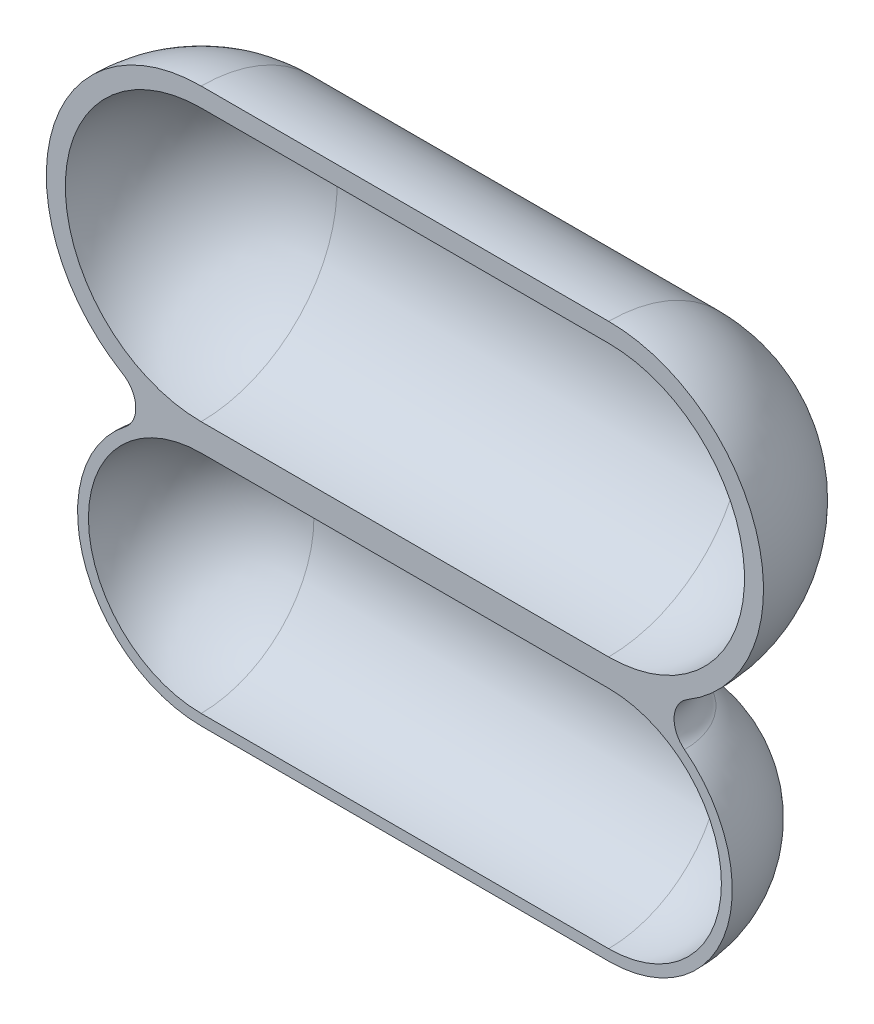
ISO-10303-21;
HEADER;
FILE_DESCRIPTION(('STEP AP214'),'2;1');
FILE_NAME('part.step','',(''),(''),'','','');
FILE_SCHEMA(('AUTOMOTIVE_DESIGN { 1 0 10303 214 1 1 1 1 }'));
ENDSEC;
DATA;
#1=APPLICATION_CONTEXT('core data for automotive mechanical design processes');
#2=APPLICATION_PROTOCOL_DEFINITION('international standard','automotive_design',2000,#1);
#3=PRODUCT_CONTEXT('',#1,'mechanical');
#4=PRODUCT('Part','Part','',(#3));
#5=PRODUCT_RELATED_PRODUCT_CATEGORY('part','',(#4));
#6=PRODUCT_DEFINITION_FORMATION('','',#4);
#7=PRODUCT_DEFINITION_CONTEXT('part definition',#1,'design');
#8=PRODUCT_DEFINITION('design','',#6,#7);
#9=PRODUCT_DEFINITION_SHAPE('','',#8);
#10=(LENGTH_UNIT() NAMED_UNIT(*) SI_UNIT(.MILLI.,.METRE.));
#11=(NAMED_UNIT(*) PLANE_ANGLE_UNIT() SI_UNIT($,.RADIAN.));
#12=(NAMED_UNIT(*) SI_UNIT($,.STERADIAN.) SOLID_ANGLE_UNIT());
#13=UNCERTAINTY_MEASURE_WITH_UNIT(LENGTH_MEASURE(1.E-05),#10,'distance_accuracy_value','');
#14=(GEOMETRIC_REPRESENTATION_CONTEXT(3) GLOBAL_UNCERTAINTY_ASSIGNED_CONTEXT((#13)) GLOBAL_UNIT_ASSIGNED_CONTEXT((#10,
#11,#12)) REPRESENTATION_CONTEXT('',''));
#15=CARTESIAN_POINT('',(0.,0.,0.));
#16=DIRECTION('',(0.,0.,1.));
#17=DIRECTION('',(1.,0.,0.));
#18=AXIS2_PLACEMENT_3D('',#15,#16,#17);
#19=CARTESIAN_POINT('',(436.813597297246,55.,0.));
#20=DIRECTION('',(-1.,0.,0.));
#21=DIRECTION('',(0.,0.,1.));
#22=AXIS2_PLACEMENT_3D('',#19,#20,#21);
#23=CYLINDRICAL_SURFACE('',#22,50.);
#24=CARTESIAN_POINT('',(150.,55.,0.));
#25=DIRECTION('',(1.,0.,0.));
#26=DIRECTION('',(0.,0.,-1.));
#27=AXIS2_PLACEMENT_3D('',#24,#25,#26);
#28=CIRCLE('',#27,50.);
#29=CARTESIAN_POINT('',(150.,105.,0.));
#30=VERTEX_POINT('',#29);
#31=CARTESIAN_POINT('',(150.,5.,0.));
#32=VERTEX_POINT('',#31);
#33=EDGE_CURVE('E174',#30,#32,#28,.F.);
#34=ORIENTED_EDGE('',*,*,#33,.F.);
#35=DIRECTION('',(-1.,0.,0.));
#36=VECTOR('',#35,1.);
#37=CARTESIAN_POINT('',(436.813597297246,105.,0.));
#38=LINE('',#37,#36);
#39=CARTESIAN_POINT('',(0.,105.,0.));
#40=VERTEX_POINT('',#39);
#41=EDGE_CURVE('E39',#30,#40,#38,.T.);
#42=ORIENTED_EDGE('',*,*,#41,.T.);
#43=CARTESIAN_POINT('',(0.,55.,0.));
#44=DIRECTION('',(-1.,0.,0.));
#45=DIRECTION('',(0.,0.,1.));
#46=AXIS2_PLACEMENT_3D('',#43,#44,#45);
#47=CIRCLE('',#46,50.);
#48=CARTESIAN_POINT('',(0.,5.,0.));
#49=VERTEX_POINT('',#48);
#50=EDGE_CURVE('E167',#40,#49,#47,.T.);
#51=ORIENTED_EDGE('',*,*,#50,.T.);
#52=DIRECTION('',(-1.,0.,0.));
#53=VECTOR('',#52,1.);
#54=CARTESIAN_POINT('',(436.813597297246,5.,0.));
#55=LINE('',#54,#53);
#56=EDGE_CURVE('E169',#32,#49,#55,.T.);
#57=ORIENTED_EDGE('',*,*,#56,.F.);
#58=EDGE_LOOP('',(#34,#42,#51,#57));
#59=FACE_BOUND('',#58,.T.);
#60=ADVANCED_FACE('F36',(#59),#23,.F.);
#61=CARTESIAN_POINT('',(436.813597297246,5.,0.));
#62=DIRECTION('',(0.,0.,-1.));
#63=DIRECTION('',(0.,1.,0.));
#64=AXIS2_PLACEMENT_3D('',#61,#62,#63);
#65=PLANE('',#64);
#66=ORIENTED_EDGE('',*,*,#41,.F.);
#67=CARTESIAN_POINT('',(150.,55.,0.));
#68=DIRECTION('',(0.,0.,-1.));
#69=DIRECTION('',(-1.,0.,0.));
#70=AXIS2_PLACEMENT_3D('',#67,#68,#69);
#71=CIRCLE('',#70,50.);
#72=EDGE_CURVE('E128',#30,#32,#71,.T.);
#73=ORIENTED_EDGE('',*,*,#72,.T.);
#74=ORIENTED_EDGE('',*,*,#56,.T.);
#75=CARTESIAN_POINT('',(0.,55.,0.));
#76=DIRECTION('',(0.,0.,1.));
#77=DIRECTION('',(1.,0.,0.));
#78=AXIS2_PLACEMENT_3D('',#75,#76,#77);
#79=CIRCLE('',#78,50.);
#80=EDGE_CURVE('E137',#40,#49,#79,.T.);
#81=ORIENTED_EDGE('',*,*,#80,.F.);
#82=EDGE_LOOP('',(#66,#73,#74,#81));
#83=FACE_BOUND('',#82,.T.);
#84=DIRECTION('',(-1.,0.,0.));
#85=VECTOR('',#84,1.);
#86=CARTESIAN_POINT('',(436.813597297246,-4.99999999999999,0.));
#87=LINE('',#86,#85);
#88=CARTESIAN_POINT('',(150.,-4.99999999999999,0.));
#89=VERTEX_POINT('',#88);
#90=CARTESIAN_POINT('',(0.,-4.99999999999999,0.));
#91=VERTEX_POINT('',#90);
#92=EDGE_CURVE('E166',#89,#91,#87,.T.);
#93=ORIENTED_EDGE('',*,*,#92,.F.);
#94=CARTESIAN_POINT('',(150.,-46.5,0.));
#95=DIRECTION('',(0.,0.,-1.));
#96=DIRECTION('',(-1.,0.,0.));
#97=AXIS2_PLACEMENT_3D('',#94,#95,#96);
#98=CIRCLE('',#97,41.5);
#99=CARTESIAN_POINT('',(150.,-88.,0.));
#100=VERTEX_POINT('',#99);
#101=EDGE_CURVE('E123',#89,#100,#98,.T.);
#102=ORIENTED_EDGE('',*,*,#101,.T.);
#103=DIRECTION('',(-1.,0.,0.));
#104=VECTOR('',#103,1.);
#105=CARTESIAN_POINT('',(436.813597297246,-88.,0.));
#106=LINE('',#105,#104);
#107=CARTESIAN_POINT('',(0.,-88.,0.));
#108=VERTEX_POINT('',#107);
#109=EDGE_CURVE('E118',#100,#108,#106,.T.);
#110=ORIENTED_EDGE('',*,*,#109,.T.);
#111=CARTESIAN_POINT('',(0.,-46.5,0.));
#112=DIRECTION('',(0.,0.,1.));
#113=DIRECTION('',(1.,0.,0.));
#114=AXIS2_PLACEMENT_3D('',#111,#112,#113);
#115=CIRCLE('',#114,41.5);
#116=EDGE_CURVE('E72',#91,#108,#115,.T.);
#117=ORIENTED_EDGE('',*,*,#116,.F.);
#118=EDGE_LOOP('',(#93,#102,#110,#117));
#119=FACE_BOUND('',#118,.T.);
#120=CARTESIAN_POINT('',(150.,55.,0.));
#121=DIRECTION('',(0.,0.,1.));
#122=DIRECTION('',(-1.,0.,0.));
#123=AXIS2_PLACEMENT_3D('',#120,#121,#122);
#124=CIRCLE('',#123,57.);
#125=CARTESIAN_POINT('',(178.986658103064,5.92074112197632,1.01206375842275E-13));
#126=VERTEX_POINT('',#125);
#127=CARTESIAN_POINT('',(150.,112.,0.));
#128=VERTEX_POINT('',#127);
#129=EDGE_CURVE('E125',#126,#128,#124,.T.);
#130=ORIENTED_EDGE('',*,*,#129,.T.);
#131=DIRECTION('',(-1.,0.,0.));
#132=VECTOR('',#131,1.);
#133=CARTESIAN_POINT('',(436.813597297246,112.,0.));
#134=LINE('',#133,#132);
#135=CARTESIAN_POINT('',(0.,112.,0.));
#136=VERTEX_POINT('',#135);
#137=EDGE_CURVE('E157',#128,#136,#134,.T.);
#138=ORIENTED_EDGE('',*,*,#137,.T.);
#139=CARTESIAN_POINT('',(0.,55.,0.));
#140=DIRECTION('',(0.,0.,-1.));
#141=DIRECTION('',(1.,0.,0.));
#142=AXIS2_PLACEMENT_3D('',#139,#140,#141);
#143=CIRCLE('',#142,57.);
#144=CARTESIAN_POINT('',(-28.9866581030642,5.92074112197632,1.01206375842275E-13));
#145=VERTEX_POINT('',#144);
#146=EDGE_CURVE('E145',#145,#136,#143,.T.);
#147=ORIENTED_EDGE('',*,*,#146,.F.);
#148=CARTESIAN_POINT('',(-34.0720367176368,-2.68965517241379,1.18961880376007E-13));
#149=DIRECTION('',(0.,0.,1.));
#150=DIRECTION('',(1.,0.,0.));
#151=AXIS2_PLACEMENT_3D('',#148,#149,#150);
#152=CIRCLE('',#151,10.);
#153=CARTESIAN_POINT('',(-27.9329310027473,-10.5834109972041,0.));
#154=VERTEX_POINT('',#153);
#155=EDGE_CURVE('E142',#154,#145,#152,.T.);
#156=ORIENTED_EDGE('',*,*,#155,.F.);
#157=CARTESIAN_POINT('',(0.,-46.5,0.));
#158=DIRECTION('',(0.,0.,-1.));
#159=DIRECTION('',(1.,0.,0.));
#160=AXIS2_PLACEMENT_3D('',#157,#158,#159);
#161=CIRCLE('',#160,45.5);
#162=CARTESIAN_POINT('',(0.,-92.,0.));
#163=VERTEX_POINT('',#162);
#164=EDGE_CURVE('E116',#163,#154,#161,.T.);
#165=ORIENTED_EDGE('',*,*,#164,.F.);
#166=DIRECTION('',(-1.,0.,0.));
#167=VECTOR('',#166,1.);
#168=CARTESIAN_POINT('',(436.813597297246,-92.,0.));
#169=LINE('',#168,#167);
#170=CARTESIAN_POINT('',(150.,-92.,0.));
#171=VERTEX_POINT('',#170);
#172=EDGE_CURVE('E97',#171,#163,#169,.T.);
#173=ORIENTED_EDGE('',*,*,#172,.F.);
#174=CARTESIAN_POINT('',(150.,-46.5,0.));
#175=DIRECTION('',(0.,0.,1.));
#176=DIRECTION('',(-1.,0.,0.));
#177=AXIS2_PLACEMENT_3D('',#174,#175,#176);
#178=CIRCLE('',#177,45.5);
#179=CARTESIAN_POINT('',(177.932931002747,-10.5834109972041,0.));
#180=VERTEX_POINT('',#179);
#181=EDGE_CURVE('E112',#171,#180,#178,.T.);
#182=ORIENTED_EDGE('',*,*,#181,.T.);
#183=CARTESIAN_POINT('',(184.072036717637,-2.68965517241379,1.18961880376007E-13));
#184=DIRECTION('',(0.,0.,-1.));
#185=DIRECTION('',(-1.,0.,0.));
#186=AXIS2_PLACEMENT_3D('',#183,#184,#185);
#187=CIRCLE('',#186,10.);
#188=EDGE_CURVE('E122',#180,#126,#187,.T.);
#189=ORIENTED_EDGE('',*,*,#188,.T.);
#190=EDGE_LOOP('',(#130,#138,#147,#156,#165,#173,#182,#189));
#191=FACE_BOUND('',#190,.T.);
#192=ADVANCED_FACE('F109',(#83,#119,#191),#65,.F.);
#193=CARTESIAN_POINT('',(436.813597297246,-46.5,0.));
#194=DIRECTION('',(-1.,0.,0.));
#195=DIRECTION('',(0.,0.,1.));
#196=AXIS2_PLACEMENT_3D('',#193,#194,#195);
#197=CYLINDRICAL_SURFACE('',#196,41.5);
#198=CARTESIAN_POINT('',(150.,-46.5,0.));
#199=DIRECTION('',(1.,0.,0.));
#200=DIRECTION('',(0.,0.,-1.));
#201=AXIS2_PLACEMENT_3D('',#198,#199,#200);
#202=CIRCLE('',#201,41.5);
#203=EDGE_CURVE('E82',#89,#100,#202,.F.);
#204=ORIENTED_EDGE('',*,*,#203,.F.);
#205=ORIENTED_EDGE('',*,*,#92,.T.);
#206=CARTESIAN_POINT('',(0.,-46.5,0.));
#207=DIRECTION('',(-1.,0.,0.));
#208=DIRECTION('',(0.,0.,1.));
#209=AXIS2_PLACEMENT_3D('',#206,#207,#208);
#210=CIRCLE('',#209,41.5);
#211=EDGE_CURVE('E163',#91,#108,#210,.T.);
#212=ORIENTED_EDGE('',*,*,#211,.T.);
#213=ORIENTED_EDGE('',*,*,#109,.F.);
#214=EDGE_LOOP('',(#204,#205,#212,#213));
#215=FACE_BOUND('',#214,.T.);
#216=ADVANCED_FACE('F237',(#215),#197,.F.);
#217=CARTESIAN_POINT('',(436.813597297246,-46.5,0.));
#218=DIRECTION('',(-1.,0.,0.));
#219=DIRECTION('',(0.,0.,1.));
#220=AXIS2_PLACEMENT_3D('',#217,#218,#219);
#221=CYLINDRICAL_SURFACE('',#220,45.5);
#222=CARTESIAN_POINT('',(150.,-46.5,0.));
#223=DIRECTION('',(1.,0.,0.));
#224=DIRECTION('',(0.,0.,-1.));
#225=AXIS2_PLACEMENT_3D('',#222,#223,#224);
#226=CIRCLE('',#225,45.5);
#227=CARTESIAN_POINT('',(150.,-10.5834109972041,-27.9329310027473));
#228=VERTEX_POINT('',#227);
#229=EDGE_CURVE('E92',#171,#228,#226,.T.);
#230=ORIENTED_EDGE('',*,*,#229,.F.);
#231=ORIENTED_EDGE('',*,*,#172,.T.);
#232=CARTESIAN_POINT('',(0.,-46.5,0.));
#233=DIRECTION('',(1.,0.,0.));
#234=DIRECTION('',(0.,0.,1.));
#235=AXIS2_PLACEMENT_3D('',#232,#233,#234);
#236=CIRCLE('',#235,45.5);
#237=CARTESIAN_POINT('',(0.,-10.5834109972041,-27.9329310027473));
#238=VERTEX_POINT('',#237);
#239=EDGE_CURVE('E117',#163,#238,#236,.T.);
#240=ORIENTED_EDGE('',*,*,#239,.T.);
#241=DIRECTION('',(-1.,0.,0.));
#242=VECTOR('',#241,1.);
#243=CARTESIAN_POINT('',(436.813597297246,-10.5834109972041,-27.9329310027473));
#244=LINE('',#243,#242);
#245=EDGE_CURVE('E99',#228,#238,#244,.T.);
#246=ORIENTED_EDGE('',*,*,#245,.F.);
#247=EDGE_LOOP('',(#230,#231,#240,#246));
#248=FACE_BOUND('',#247,.T.);
#249=ADVANCED_FACE('F94',(#248),#221,.T.);
#250=CARTESIAN_POINT('',(436.813597297246,-2.68965517241379,-34.0720367176368));
#251=DIRECTION('',(-1.,0.,0.));
#252=DIRECTION('',(0.,0.,1.));
#253=AXIS2_PLACEMENT_3D('',#250,#251,#252);
#254=CYLINDRICAL_SURFACE('',#253,10.);
#255=CARTESIAN_POINT('',(150.,-2.68965517241379,-34.0720367176368));
#256=DIRECTION('',(1.,0.,0.));
#257=DIRECTION('',(0.,0.,-1.));
#258=AXIS2_PLACEMENT_3D('',#255,#256,#257);
#259=CIRCLE('',#258,10.);
#260=CARTESIAN_POINT('',(150.,5.92074112197632,-28.9866581030642));
#261=VERTEX_POINT('',#260);
#262=EDGE_CURVE('E44',#228,#261,#259,.F.);
#263=ORIENTED_EDGE('',*,*,#262,.F.);
#264=ORIENTED_EDGE('',*,*,#245,.T.);
#265=CARTESIAN_POINT('',(0.,-2.68965517241379,-34.0720367176368));
#266=DIRECTION('',(-1.,0.,0.));
#267=DIRECTION('',(0.,0.,1.));
#268=AXIS2_PLACEMENT_3D('',#265,#266,#267);
#269=CIRCLE('',#268,10.);
#270=CARTESIAN_POINT('',(0.,5.92074112197632,-28.9866581030642));
#271=VERTEX_POINT('',#270);
#272=EDGE_CURVE('E159',#238,#271,#269,.T.);
#273=ORIENTED_EDGE('',*,*,#272,.T.);
#274=DIRECTION('',(-1.,0.,0.));
#275=VECTOR('',#274,1.);
#276=CARTESIAN_POINT('',(436.813597297246,5.92074112197632,-28.9866581030642));
#277=LINE('',#276,#275);
#278=EDGE_CURVE('E158',#261,#271,#277,.T.);
#279=ORIENTED_EDGE('',*,*,#278,.F.);
#280=EDGE_LOOP('',(#263,#264,#273,#279));
#281=FACE_BOUND('',#280,.T.);
#282=ADVANCED_FACE('F245',(#281),#254,.F.);
#283=CARTESIAN_POINT('',(436.813597297246,55.,0.));
#284=DIRECTION('',(-1.,0.,0.));
#285=DIRECTION('',(0.,0.,1.));
#286=AXIS2_PLACEMENT_3D('',#283,#284,#285);
#287=CYLINDRICAL_SURFACE('',#286,57.);
#288=CARTESIAN_POINT('',(150.,55.,0.));
#289=DIRECTION('',(1.,0.,0.));
#290=DIRECTION('',(0.,0.,-1.));
#291=AXIS2_PLACEMENT_3D('',#288,#289,#290);
#292=CIRCLE('',#291,57.);
#293=EDGE_CURVE('E12',#261,#128,#292,.T.);
#294=ORIENTED_EDGE('',*,*,#293,.F.);
#295=ORIENTED_EDGE('',*,*,#278,.T.);
#296=CARTESIAN_POINT('',(0.,55.,0.));
#297=DIRECTION('',(1.,0.,0.));
#298=DIRECTION('',(0.,0.,1.));
#299=AXIS2_PLACEMENT_3D('',#296,#297,#298);
#300=CIRCLE('',#299,57.);
#301=EDGE_CURVE('E154',#271,#136,#300,.T.);
#302=ORIENTED_EDGE('',*,*,#301,.T.);
#303=ORIENTED_EDGE('',*,*,#137,.F.);
#304=EDGE_LOOP('',(#294,#295,#302,#303));
#305=FACE_BOUND('',#304,.T.);
#306=ADVANCED_FACE('F190',(#305),#287,.T.);
#307=CARTESIAN_POINT('',(0.,55.,0.));
#308=DIRECTION('',(0.,-1.,0.));
#309=DIRECTION('',(-1.,0.,0.));
#310=AXIS2_PLACEMENT_3D('',#307,#308,#309);
#311=SPHERICAL_SURFACE('',#310,50.);
#312=ORIENTED_EDGE('',*,*,#50,.F.);
#313=ORIENTED_EDGE('',*,*,#80,.T.);
#314=EDGE_LOOP('',(#312,#313));
#315=FACE_BOUND('',#314,.T.);
#316=ADVANCED_FACE('F213',(#315),#311,.F.);
#317=CARTESIAN_POINT('',(0.,55.,0.));
#318=DIRECTION('',(0.,-1.,0.));
#319=DIRECTION('',(-1.,0.,0.));
#320=AXIS2_PLACEMENT_3D('',#317,#318,#319);
#321=SPHERICAL_SURFACE('',#320,57.);
#322=CARTESIAN_POINT('',(0.,5.92074112197633,0.));
#323=DIRECTION('',(0.,-1.,0.));
#324=DIRECTION('',(0.,0.,-1.));
#325=AXIS2_PLACEMENT_3D('',#322,#323,#324);
#326=CIRCLE('',#325,28.9866581030642);
#327=EDGE_CURVE('E151',#145,#271,#326,.T.);
#328=ORIENTED_EDGE('',*,*,#327,.F.);
#329=ORIENTED_EDGE('',*,*,#146,.T.);
#330=ORIENTED_EDGE('',*,*,#301,.F.);
#331=EDGE_LOOP('',(#328,#329,#330));
#332=FACE_BOUND('',#331,.T.);
#333=ADVANCED_FACE('F194',(#332),#321,.T.);
#334=CARTESIAN_POINT('',(0.,-2.68965517241379,0.));
#335=DIRECTION('',(0.,-1.,0.));
#336=DIRECTION('',(0.,0.,-1.));
#337=AXIS2_PLACEMENT_3D('',#334,#335,#336);
#338=TOROIDAL_SURFACE('',#337,34.0720367176368,10.);
#339=CARTESIAN_POINT('',(0.,-10.5834109972041,0.));
#340=DIRECTION('',(0.,-1.,0.));
#341=DIRECTION('',(0.,0.,-1.));
#342=AXIS2_PLACEMENT_3D('',#339,#340,#341);
#343=CIRCLE('',#342,27.9329310027473);
#344=EDGE_CURVE('E148',#154,#238,#343,.T.);
#345=ORIENTED_EDGE('',*,*,#344,.F.);
#346=ORIENTED_EDGE('',*,*,#155,.T.);
#347=ORIENTED_EDGE('',*,*,#327,.T.);
#348=ORIENTED_EDGE('',*,*,#272,.F.);
#349=EDGE_LOOP('',(#345,#346,#347,#348));
#350=FACE_BOUND('',#349,.T.);
#351=ADVANCED_FACE('F253',(#350),#338,.F.);
#352=CARTESIAN_POINT('',(0.,-46.5,0.));
#353=DIRECTION('',(0.,-1.,0.));
#354=DIRECTION('',(-1.,0.,0.));
#355=AXIS2_PLACEMENT_3D('',#352,#353,#354);
#356=SPHERICAL_SURFACE('',#355,45.5);
#357=ORIENTED_EDGE('',*,*,#239,.F.);
#358=ORIENTED_EDGE('',*,*,#164,.T.);
#359=ORIENTED_EDGE('',*,*,#344,.T.);
#360=EDGE_LOOP('',(#357,#358,#359));
#361=FACE_BOUND('',#360,.T.);
#362=ADVANCED_FACE('F229',(#361),#356,.T.);
#363=CARTESIAN_POINT('',(0.,-46.5,0.));
#364=DIRECTION('',(0.,-1.,0.));
#365=DIRECTION('',(1.,0.,0.));
#366=AXIS2_PLACEMENT_3D('',#363,#364,#365);
#367=SPHERICAL_SURFACE('',#366,41.5);
#368=ORIENTED_EDGE('',*,*,#211,.F.);
#369=ORIENTED_EDGE('',*,*,#116,.T.);
#370=EDGE_LOOP('',(#368,#369));
#371=FACE_BOUND('',#370,.T.);
#372=ADVANCED_FACE('F220',(#371),#367,.F.);
#373=CARTESIAN_POINT('',(150.,55.,0.));
#374=DIRECTION('',(0.,-1.,0.));
#375=DIRECTION('',(1.,0.,0.));
#376=AXIS2_PLACEMENT_3D('',#373,#374,#375);
#377=SPHERICAL_SURFACE('',#376,50.);
#378=ORIENTED_EDGE('',*,*,#33,.T.);
#379=ORIENTED_EDGE('',*,*,#72,.F.);
#380=EDGE_LOOP('',(#378,#379));
#381=FACE_BOUND('',#380,.T.);
#382=ADVANCED_FACE('F217',(#381),#377,.F.);
#383=CARTESIAN_POINT('',(150.,55.,0.));
#384=DIRECTION('',(0.,-1.,0.));
#385=DIRECTION('',(1.,0.,0.));
#386=AXIS2_PLACEMENT_3D('',#383,#384,#385);
#387=SPHERICAL_SURFACE('',#386,57.);
#388=CARTESIAN_POINT('',(150.,5.92074112197633,0.));
#389=DIRECTION('',(0.,1.,0.));
#390=DIRECTION('',(0.,0.,-1.));
#391=AXIS2_PLACEMENT_3D('',#388,#389,#390);
#392=CIRCLE('',#391,28.9866581030642);
#393=EDGE_CURVE('E134',#126,#261,#392,.T.);
#394=ORIENTED_EDGE('',*,*,#393,.T.);
#395=ORIENTED_EDGE('',*,*,#293,.T.);
#396=ORIENTED_EDGE('',*,*,#129,.F.);
#397=EDGE_LOOP('',(#394,#395,#396));
#398=FACE_BOUND('',#397,.T.);
#399=ADVANCED_FACE('F219',(#398),#387,.T.);
#400=CARTESIAN_POINT('',(150.,-2.68965517241379,0.));
#401=DIRECTION('',(0.,-1.,0.));
#402=DIRECTION('',(0.,0.,-1.));
#403=AXIS2_PLACEMENT_3D('',#400,#401,#402);
#404=TOROIDAL_SURFACE('',#403,34.0720367176368,10.);
#405=CARTESIAN_POINT('',(150.,-10.5834109972041,0.));
#406=DIRECTION('',(0.,1.,0.));
#407=DIRECTION('',(0.,0.,-1.));
#408=AXIS2_PLACEMENT_3D('',#405,#406,#407);
#409=CIRCLE('',#408,27.9329310027473);
#410=EDGE_CURVE('E121',#180,#228,#409,.T.);
#411=ORIENTED_EDGE('',*,*,#410,.T.);
#412=ORIENTED_EDGE('',*,*,#262,.T.);
#413=ORIENTED_EDGE('',*,*,#393,.F.);
#414=ORIENTED_EDGE('',*,*,#188,.F.);
#415=EDGE_LOOP('',(#411,#412,#413,#414));
#416=FACE_BOUND('',#415,.T.);
#417=ADVANCED_FACE('F226',(#416),#404,.F.);
#418=CARTESIAN_POINT('',(150.,-46.5,0.));
#419=DIRECTION('',(0.,-1.,0.));
#420=DIRECTION('',(1.,0.,0.));
#421=AXIS2_PLACEMENT_3D('',#418,#419,#420);
#422=SPHERICAL_SURFACE('',#421,45.5);
#423=ORIENTED_EDGE('',*,*,#229,.T.);
#424=ORIENTED_EDGE('',*,*,#410,.F.);
#425=ORIENTED_EDGE('',*,*,#181,.F.);
#426=EDGE_LOOP('',(#423,#424,#425));
#427=FACE_BOUND('',#426,.T.);
#428=ADVANCED_FACE('F120',(#427),#422,.T.);
#429=CARTESIAN_POINT('',(150.,-46.5,0.));
#430=DIRECTION('',(0.,-1.,0.));
#431=DIRECTION('',(-1.,0.,0.));
#432=AXIS2_PLACEMENT_3D('',#429,#430,#431);
#433=SPHERICAL_SURFACE('',#432,41.5);
#434=ORIENTED_EDGE('',*,*,#203,.T.);
#435=ORIENTED_EDGE('',*,*,#101,.F.);
#436=EDGE_LOOP('',(#434,#435));
#437=FACE_BOUND('',#436,.T.);
#438=ADVANCED_FACE('F265',(#437),#433,.F.);
#439=CLOSED_SHELL('',(#60,#192,#216,#249,#282,#306,#316,#333,#351,#362,#372,#382,#399,#417,#428,#438));
#440=MANIFOLD_SOLID_BREP('B2',#439);
#441=ADVANCED_BREP_SHAPE_REPRESENTATION('',(#18,#440),#14);
#442=SHAPE_DEFINITION_REPRESENTATION(#9,#441);
ENDSEC;
END-ISO-10303-21;
